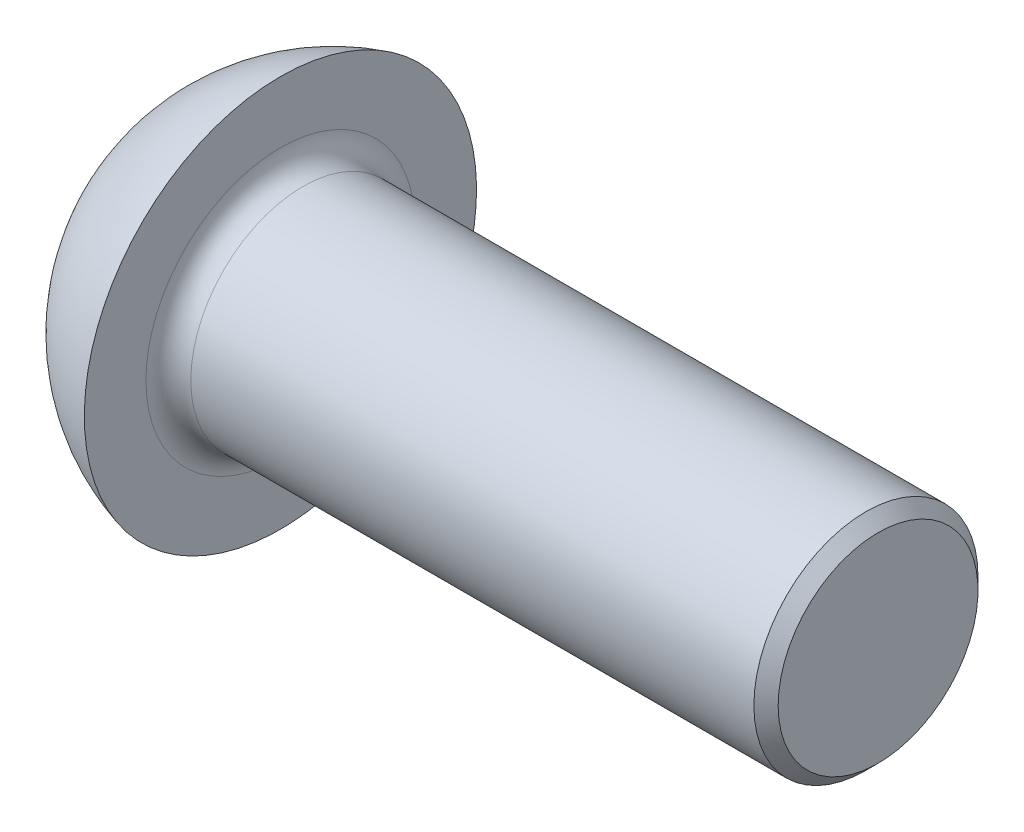
ISO-10303-21;
HEADER;
FILE_DESCRIPTION(('STEP AP214'),'2;1');
FILE_NAME('part.step','',(''),(''),'','','');
FILE_SCHEMA(('AUTOMOTIVE_DESIGN { 1 0 10303 214 1 1 1 1 }'));
ENDSEC;
DATA;
#1=APPLICATION_CONTEXT('core data for automotive mechanical design processes');
#2=APPLICATION_PROTOCOL_DEFINITION('international standard','automotive_design',2000,#1);
#3=PRODUCT_CONTEXT('',#1,'mechanical');
#4=PRODUCT('Part','Part','',(#3));
#5=PRODUCT_RELATED_PRODUCT_CATEGORY('part','',(#4));
#6=PRODUCT_DEFINITION_FORMATION('','',#4);
#7=PRODUCT_DEFINITION_CONTEXT('part definition',#1,'design');
#8=PRODUCT_DEFINITION('design','',#6,#7);
#9=PRODUCT_DEFINITION_SHAPE('','',#8);
#10=(LENGTH_UNIT() NAMED_UNIT(*) SI_UNIT(.MILLI.,.METRE.));
#11=(NAMED_UNIT(*) PLANE_ANGLE_UNIT() SI_UNIT($,.RADIAN.));
#12=(NAMED_UNIT(*) SI_UNIT($,.STERADIAN.) SOLID_ANGLE_UNIT());
#13=UNCERTAINTY_MEASURE_WITH_UNIT(LENGTH_MEASURE(1.E-05),#10,'distance_accuracy_value','');
#14=(GEOMETRIC_REPRESENTATION_CONTEXT(3) GLOBAL_UNCERTAINTY_ASSIGNED_CONTEXT((#13)) GLOBAL_UNIT_ASSIGNED_CONTEXT((#10,
#11,#12)) REPRESENTATION_CONTEXT('',''));
#15=CARTESIAN_POINT('',(0.,0.,0.));
#16=DIRECTION('',(0.,0.,1.));
#17=DIRECTION('',(1.,0.,0.));
#18=AXIS2_PLACEMENT_3D('',#15,#16,#17);
#19=CARTESIAN_POINT('',(-3.3,0.,0.));
#20=DIRECTION('',(-1.,0.,0.));
#21=DIRECTION('',(0.,0.,1.));
#22=AXIS2_PLACEMENT_3D('',#19,#20,#21);
#23=PLANE('',#22);
#24=CARTESIAN_POINT('',(-3.3,0.,0.));
#25=DIRECTION('',(-1.,0.,0.));
#26=DIRECTION('',(0.,0.,1.));
#27=AXIS2_PLACEMENT_3D('',#24,#25,#26);
#28=CIRCLE('',#27,2.71809868883777);
#29=CARTESIAN_POINT('',(-3.3,2.71809868883778,0.));
#30=VERTEX_POINT('',#29);
#31=EDGE_CURVE('E230',#30,#30,#28,.T.);
#32=ORIENTED_EDGE('',*,*,#31,.T.);
#33=EDGE_LOOP('',(#32));
#34=FACE_BOUND('',#33,.T.);
#35=DIRECTION('',(0.,0.,1.));
#36=VECTOR('',#35,1.);
#37=CARTESIAN_POINT('',(-3.3,2.00051868274205,0.));
#38=LINE('',#37,#36);
#39=CARTESIAN_POINT('',(-3.3,2.00051868274205,-1.155));
#40=VERTEX_POINT('',#39);
#41=CARTESIAN_POINT('',(-3.3,2.00051868274205,1.155));
#42=VERTEX_POINT('',#41);
#43=EDGE_CURVE('E111',#40,#42,#38,.T.);
#44=ORIENTED_EDGE('',*,*,#43,.T.);
#45=DIRECTION('',(0.,-0.866025403784439,0.5));
#46=VECTOR('',#45,1.);
#47=CARTESIAN_POINT('',(-3.3,1.00025934137103,1.7325));
#48=LINE('',#47,#46);
#49=CARTESIAN_POINT('',(-3.3,0.,2.31));
#50=VERTEX_POINT('',#49);
#51=EDGE_CURVE('E10',#42,#50,#48,.T.);
#52=ORIENTED_EDGE('',*,*,#51,.T.);
#53=DIRECTION('',(0.,-0.866025403784439,-0.5));
#54=VECTOR('',#53,1.);
#55=CARTESIAN_POINT('',(-3.3,-1.00025934137103,1.7325));
#56=LINE('',#55,#54);
#57=CARTESIAN_POINT('',(-3.3,-2.00051868274205,1.155));
#58=VERTEX_POINT('',#57);
#59=EDGE_CURVE('E24',#50,#58,#56,.T.);
#60=ORIENTED_EDGE('',*,*,#59,.T.);
#61=DIRECTION('',(0.,0.,-1.));
#62=VECTOR('',#61,1.);
#63=CARTESIAN_POINT('',(-3.3,-2.00051868274205,0.));
#64=LINE('',#63,#62);
#65=CARTESIAN_POINT('',(-3.3,-2.00051868274205,-1.155));
#66=VERTEX_POINT('',#65);
#67=EDGE_CURVE('E240',#58,#66,#64,.T.);
#68=ORIENTED_EDGE('',*,*,#67,.T.);
#69=DIRECTION('',(0.,0.866025403784439,-0.5));
#70=VECTOR('',#69,1.);
#71=CARTESIAN_POINT('',(-3.3,-1.00025934137103,-1.7325));
#72=LINE('',#71,#70);
#73=CARTESIAN_POINT('',(-3.3,0.,-2.31));
#74=VERTEX_POINT('',#73);
#75=EDGE_CURVE('E236',#66,#74,#72,.T.);
#76=ORIENTED_EDGE('',*,*,#75,.T.);
#77=DIRECTION('',(0.,0.866025403784439,0.5));
#78=VECTOR('',#77,1.);
#79=CARTESIAN_POINT('',(-3.3,1.00025934137103,-1.7325));
#80=LINE('',#79,#78);
#81=EDGE_CURVE('E227',#74,#40,#80,.T.);
#82=ORIENTED_EDGE('',*,*,#81,.T.);
#83=EDGE_LOOP('',(#44,#52,#60,#68,#76,#82));
#84=FACE_BOUND('',#83,.T.);
#85=ADVANCED_FACE('F15',(#34,#84),#23,.T.);
#86=CARTESIAN_POINT('',(0.6,0.,0.));
#87=DIRECTION('',(-1.,0.,0.));
#88=DIRECTION('',(0.,0.,1.));
#89=AXIS2_PLACEMENT_3D('',#86,#87,#88);
#90=TOROIDAL_SURFACE('',#89,3.6,0.6);
#91=CARTESIAN_POINT('',(0.6,0.,0.));
#92=DIRECTION('',(-1.,0.,0.));
#93=DIRECTION('',(0.,0.,1.));
#94=AXIS2_PLACEMENT_3D('',#91,#92,#93);
#95=CIRCLE('',#94,3.);
#96=CARTESIAN_POINT('',(0.6,0.,3.));
#97=VERTEX_POINT('',#96);
#98=EDGE_CURVE('E276',#97,#97,#95,.T.);
#99=ORIENTED_EDGE('',*,*,#98,.T.);
#100=EDGE_LOOP('',(#99));
#101=FACE_BOUND('',#100,.T.);
#102=CARTESIAN_POINT('',(0.,0.,0.));
#103=DIRECTION('',(-1.,0.,0.));
#104=DIRECTION('',(0.,0.,1.));
#105=AXIS2_PLACEMENT_3D('',#102,#103,#104);
#106=CIRCLE('',#105,3.6);
#107=CARTESIAN_POINT('',(0.,0.,3.6));
#108=VERTEX_POINT('',#107);
#109=EDGE_CURVE('E220',#108,#108,#106,.T.);
#110=ORIENTED_EDGE('',*,*,#109,.F.);
#111=EDGE_LOOP('',(#110));
#112=FACE_BOUND('',#111,.T.);
#113=ADVANCED_FACE('F17',(#101,#112),#90,.F.);
#114=CARTESIAN_POINT('',(0.,3.6,0.));
#115=DIRECTION('',(-1.,0.,0.));
#116=DIRECTION('',(0.,0.,1.));
#117=AXIS2_PLACEMENT_3D('',#114,#115,#116);
#118=PLANE('',#117);
#119=CARTESIAN_POINT('',(0.,0.,0.));
#120=DIRECTION('',(-1.,0.,0.));
#121=DIRECTION('',(0.,0.,1.));
#122=AXIS2_PLACEMENT_3D('',#119,#120,#121);
#123=CIRCLE('',#122,5.25);
#124=CARTESIAN_POINT('',(0.,5.25,0.));
#125=VERTEX_POINT('',#124);
#126=EDGE_CURVE('E217',#125,#125,#123,.T.);
#127=ORIENTED_EDGE('',*,*,#126,.F.);
#128=EDGE_LOOP('',(#127));
#129=FACE_BOUND('',#128,.T.);
#130=ORIENTED_EDGE('',*,*,#109,.T.);
#131=EDGE_LOOP('',(#130));
#132=FACE_BOUND('',#131,.T.);
#133=ADVANCED_FACE('F200',(#129,#132),#118,.F.);
#134=CARTESIAN_POINT('',(1.40673326026339,0.,0.));
#135=DIRECTION('',(-1.,0.,0.));
#136=DIRECTION('',(0.,1.,0.));
#137=AXIS2_PLACEMENT_3D('',#134,#135,#136);
#138=SPHERICAL_SURFACE('',#137,5.43519994715294);
#139=CARTESIAN_POINT('',(-3.3,2.71809868883778,0.));
#140=CARTESIAN_POINT('',(-3.27776570778857,2.75660042690061,0.));
#141=CARTESIAN_POINT('',(-3.25505879454552,2.79482922452048,0.));
#142=CARTESIAN_POINT('',(-3.20871384233075,2.87071818755479,0.));
#143=CARTESIAN_POINT('',(-3.18507580335902,2.90837835296923,0.));
#144=CARTESIAN_POINT('',(-3.13688271602146,2.98310730027314,0.));
#145=CARTESIAN_POINT('',(-3.11232766765562,3.02017608216262,0.));
#146=CARTESIAN_POINT('',(-3.06231538033311,3.09369995898224,0.));
#147=CARTESIAN_POINT('',(-3.03685814137642,3.13015505391239,0.));
#148=CARTESIAN_POINT('',(-2.98505679471658,3.20242959835595,0.));
#149=CARTESIAN_POINT('',(-2.95871268701341,3.23824904786935,0.));
#150=CARTESIAN_POINT('',(-2.90515346956454,3.30923073239539,0.));
#151=CARTESIAN_POINT('',(-2.87793835981883,3.34439296740802,0.));
#152=CARTESIAN_POINT('',(-2.82265352661596,3.41403904785795,0.));
#153=CARTESIAN_POINT('',(-2.79458380315879,3.44852289329525,0.));
#154=CARTESIAN_POINT('',(-2.73760664628698,3.51679142851922,0.));
#155=CARTESIAN_POINT('',(-2.70869921287235,3.55057611830588,0.));
#156=CARTESIAN_POINT('',(-2.65006404410115,3.61742599705813,0.));
#157=CARTESIAN_POINT('',(-2.62033630874457,3.65049118602372,0.));
#158=CARTESIAN_POINT('',(-2.56007843814651,3.71588215128081,0.));
#159=CARTESIAN_POINT('',(-2.52954830290502,3.74820792757231,0.));
#160=CARTESIAN_POINT('',(-2.46770401778455,3.81210060089351,0.));
#161=CARTESIAN_POINT('',(-2.43638986790557,3.84366749792321,0.));
#162=CARTESIAN_POINT('',(-2.37299641089524,3.90602340313269,0.));
#163=CARTESIAN_POINT('',(-2.34091710376389,3.93681241131247,0.));
#164=CARTESIAN_POINT('',(-2.27601265041062,3.99759399767809,0.));
#165=CARTESIAN_POINT('',(-2.24318750418871,4.02758657586392,0.));
#166=CARTESIAN_POINT('',(-2.17681113996081,4.08675724070804,0.));
#167=CARTESIAN_POINT('',(-2.14325992195482,4.11593532736632,0.));
#168=CARTESIAN_POINT('',(-2.07545161870568,4.17345943810852,0.));
#169=CARTESIAN_POINT('',(-2.04119453346252,4.20180546219244,0.));
#170=CARTESIAN_POINT('',(-1.97199512535929,4.25764837780733,0.));
#171=CARTESIAN_POINT('',(-1.93705280249922,4.2851452693383,0.));
#172=CARTESIAN_POINT('',(-1.86650396143256,4.33927336121637,0.));
#173=CARTESIAN_POINT('',(-1.83089744322598,4.36590456156347,0.));
#174=CARTESIAN_POINT('',(-1.75904165371523,4.41828523376225,0.));
#175=CARTESIAN_POINT('',(-1.72279238241106,4.44403470561391,0.));
#176=CARTESIAN_POINT('',(-1.64967291602002,4.49463641448721,0.));
#177=CARTESIAN_POINT('',(-1.61280272093315,4.51948865150885,0.));
#178=CARTESIAN_POINT('',(-1.53846361021198,4.56828092470242,0.));
#179=CARTESIAN_POINT('',(-1.50099469457769,4.59222096087435,0.));
#180=CARTESIAN_POINT('',(-1.42548070654649,4.63917441567621,0.));
#181=CARTESIAN_POINT('',(-1.38743563414958,4.66218783430614,0.));
#182=CARTESIAN_POINT('',(-1.31079224333973,4.70727419534119,0.));
#183=CARTESIAN_POINT('',(-1.27219392492679,4.72934713774631,0.));
#184=CARTESIAN_POINT('',(-1.19446728599589,4.77253925400262,0.));
#185=CARTESIAN_POINT('',(-1.15533896547794,4.7936584278538,0.));
#186=CARTESIAN_POINT('',(-1.0765758854167,4.8349302890371,0.));
#187=CARTESIAN_POINT('',(-1.03694112587342,4.85508297636923,0.));
#188=CARTESIAN_POINT('',(-0.957189035813875,4.89440972855083,0.));
#189=CARTESIAN_POINT('',(-0.917071705297622,4.91358379340031,0.));
#190=CARTESIAN_POINT('',(-0.836378631967217,4.9509417540421,0.));
#191=CARTESIAN_POINT('',(-0.795802889153065,4.96912564983441,0.));
#192=CARTESIAN_POINT('',(-0.714217425889179,5.00449232183398,0.));
#193=CARTESIAN_POINT('',(-0.673207705439446,5.02167509804124,0.));
#194=CARTESIAN_POINT('',(-0.590778983164408,5.05502918408769,0.));
#195=CARTESIAN_POINT('',(-0.549359981339102,5.07120049392688,0.));
#196=CARTESIAN_POINT('',(-0.466137638085642,5.10252190631043,0.));
#197=CARTESIAN_POINT('',(-0.424334296657488,5.1176720088548,0.));
#198=CARTESIAN_POINT('',(-0.340368450990369,5.14694189281806,0.));
#199=CARTESIAN_POINT('',(-0.298205946751405,5.16106167423696,0.));
#200=CARTESIAN_POINT('',(-0.213547155219295,5.18826237732713,0.));
#201=CARTESIAN_POINT('',(-0.171050867926149,5.20134329899841,0.));
#202=CARTESIAN_POINT('',(-0.0857501407696926,5.22645853845163,0.));
#203=CARTESIAN_POINT('',(-0.0429457009063826,5.23849285623358,0.));
#204=CARTESIAN_POINT('',(0.,5.25,0.));
#205=B_SPLINE_CURVE_WITH_KNOTS('',3,(#139,#140,#141,#142,#143,#144,#145,#146,#147,#148,#149,
#150,#151,#152,#153,#154,#155,#156,#157,#158,#159,#160,#161,#162,#163,#164,#165,#166,#167,#168,
#169,#170,#171,#172,#173,#174,#175,#176,#177,#178,#179,#180,#181,#182,#183,#184,#185,#186,#187,
#188,#189,#190,#191,#192,#193,#194,#195,#196,#197,#198,#199,#200,#201,#202,#203,#204),
.UNSPECIFIED.,.F.,.F.,(4,2,2,2,2,2,2,2,2,2,2,2,2,2,2,2,2,2,2,2,2,2,2,2,2,2,2,2,2,2,2,2,4),(0.,
0.133378533451595,0.266757066903191,0.400135600354786,0.533514133806381,0.666892667257976,
0.800271200709571,0.933649734161166,1.06702826761276,1.20040680106436,1.33378533451595,
1.46716386796755,1.60054240141914,1.73392093487074,1.86729946832233,2.00067800177393,
2.13405653522553,2.26743506867712,2.40081360212872,2.53419213558031,2.66757066903191,
2.8009492024835,2.9343277359351,3.06770626938669,3.20108480283829,3.33446333628988,
3.46784186974148,3.60122040319307,3.73459893664467,3.86797747009626,4.00135600354786,
4.13473453699946,4.26811307045105),.UNSPECIFIED.);
#206=EDGE_CURVE('BSEAM207',#30,#125,#205,.T.);
#207=ORIENTED_EDGE('',*,*,#31,.F.);
#208=ORIENTED_EDGE('',*,*,#126,.T.);
#209=ORIENTED_EDGE('',*,*,#206,.T.);
#210=ORIENTED_EDGE('',*,*,#206,.F.);
#211=EDGE_LOOP('',(#207,#209,#208,#210));
#212=FACE_BOUND('',#211,.T.);
#213=ADVANCED_FACE('F207',(#212),#138,.T.);
#214=CARTESIAN_POINT('',(16.,0.,0.));
#215=DIRECTION('',(-1.,0.,0.));
#216=DIRECTION('',(0.,0.,1.));
#217=AXIS2_PLACEMENT_3D('',#214,#215,#216);
#218=PLANE('',#217);
#219=CARTESIAN_POINT('',(16.,0.,0.));
#220=DIRECTION('',(-1.,0.,0.));
#221=DIRECTION('',(0.,0.,1.));
#222=AXIS2_PLACEMENT_3D('',#219,#220,#221);
#223=CIRCLE('',#222,2.67525);
#224=CARTESIAN_POINT('',(16.,0.,2.67525));
#225=VERTEX_POINT('',#224);
#226=EDGE_CURVE('E275',#225,#225,#223,.T.);
#227=ORIENTED_EDGE('',*,*,#226,.F.);
#228=EDGE_LOOP('',(#227));
#229=FACE_BOUND('',#228,.T.);
#230=ADVANCED_FACE('F206',(#229),#218,.F.);
#231=CARTESIAN_POINT('',(16.,0.,0.));
#232=DIRECTION('',(-1.,0.,0.));
#233=DIRECTION('',(0.,0.,1.));
#234=AXIS2_PLACEMENT_3D('',#231,#232,#233);
#235=CONICAL_SURFACE('',#234,2.67525,0.785398163397448);
#236=CARTESIAN_POINT('',(15.67525,0.,0.));
#237=DIRECTION('',(-1.,0.,0.));
#238=DIRECTION('',(0.,0.,1.));
#239=AXIS2_PLACEMENT_3D('',#236,#237,#238);
#240=CIRCLE('',#239,3.);
#241=CARTESIAN_POINT('',(15.67525,0.,3.));
#242=VERTEX_POINT('',#241);
#243=EDGE_CURVE('E271',#242,#242,#240,.T.);
#244=ORIENTED_EDGE('',*,*,#243,.F.);
#245=EDGE_LOOP('',(#244));
#246=FACE_BOUND('',#245,.T.);
#247=ORIENTED_EDGE('',*,*,#226,.T.);
#248=EDGE_LOOP('',(#247));
#249=FACE_BOUND('',#248,.T.);
#250=ADVANCED_FACE('F291',(#246,#249),#235,.T.);
#251=CARTESIAN_POINT('',(0.,0.,0.));
#252=DIRECTION('',(-1.,0.,0.));
#253=DIRECTION('',(0.,0.,1.));
#254=AXIS2_PLACEMENT_3D('',#251,#252,#253);
#255=CYLINDRICAL_SURFACE('',#254,3.);
#256=ORIENTED_EDGE('',*,*,#243,.T.);
#257=EDGE_LOOP('',(#256));
#258=FACE_BOUND('',#257,.T.);
#259=ORIENTED_EDGE('',*,*,#98,.F.);
#260=EDGE_LOOP('',(#259));
#261=FACE_BOUND('',#260,.T.);
#262=ADVANCED_FACE('F149',(#258,#261),#255,.T.);
#263=CARTESIAN_POINT('',(0.112679121828036,2.00051868274205,1.155));
#264=DIRECTION('',(0.,-0.5,-0.866025403784438));
#265=DIRECTION('',(0.,0.866025403784439,-0.5));
#266=AXIS2_PLACEMENT_3D('',#263,#264,#265);
#267=PLANE('',#266);
#268=DIRECTION('',(-1.,0.,0.));
#269=VECTOR('',#268,1.);
#270=CARTESIAN_POINT('',(0.112679121828036,2.00051868274205,1.155));
#271=LINE('',#270,#269);
#272=CARTESIAN_POINT('',(-1.221,2.00051868274205,1.155));
#273=VERTEX_POINT('',#272);
#274=EDGE_CURVE('E35',#273,#42,#271,.T.);
#275=ORIENTED_EDGE('',*,*,#274,.F.);
#276=CARTESIAN_POINT('',(-1.22100066666717,-1.99999999990584E-06,2.31000115470054));
#277=CARTESIAN_POINT('',(-1.19168855717919,0.0879087142789007,2.25924588014696));
#278=CARTESIAN_POINT('',(-1.16503071931838,0.176578272518489,2.20805248682841));
#279=CARTESIAN_POINT('',(-1.11850024478769,0.355452645837356,2.10477931924164));
#280=CARTESIAN_POINT('',(-1.09864406707242,0.445660638153868,2.05269771059465));
#281=CARTESIAN_POINT('',(-1.06773646866209,0.62495871934513,1.94917991515369));
#282=CARTESIAN_POINT('',(-1.05647931723026,0.714021228502352,1.89775965151706));
#283=CARTESIAN_POINT('',(-1.04304309543633,0.892565100679253,1.79467729885357));
#284=CARTESIAN_POINT('',(-1.04085289609961,0.982045815177746,1.74301558425058));
#285=CARTESIAN_POINT('',(-1.04542068601433,1.14923119457287,1.64649106045224));
#286=CARTESIAN_POINT('',(-1.05105713137857,1.2269609459042,1.60161376759706));
#287=CARTESIAN_POINT('',(-1.06891780774927,1.38191406414319,1.51215154307));
#288=CARTESIAN_POINT('',(-1.08114813406541,1.459136895502,1.46756692059741));
#289=CARTESIAN_POINT('',(-1.11172160833131,1.61440923657973,1.37792039267848));
#290=CARTESIAN_POINT('',(-1.13019429588456,1.69243910421603,1.33286982759383));
#291=CARTESIAN_POINT('',(-1.17211949687853,1.84733535485597,1.2434404355904));
#292=CARTESIAN_POINT('',(-1.19556216577033,1.92420372075742,1.19906046384503));
#293=CARTESIAN_POINT('',(-1.22100066666717,2.00052068274205,1.15499884529946));
#294=B_SPLINE_CURVE_WITH_KNOTS('',3,(#276,#277,#278,#279,#280,#281,#282,#283,#284,#285,#286,
#287,#288,#289,#290,#291,#292,#293),.UNSPECIFIED.,.F.,.F.,(4,2,2,2,2,2,2,2,4),(0.,
0.317098385044298,0.634958765896791,0.944953071500566,1.25456677031687,1.52410456996802,
1.79389195560933,2.06966196417866,2.3448907470989),.UNSPECIFIED.);
#295=CARTESIAN_POINT('',(-1.221,0.,2.31));
#296=VERTEX_POINT('',#295);
#297=EDGE_CURVE('E105',#296,#273,#294,.T.);
#298=ORIENTED_EDGE('',*,*,#297,.F.);
#299=DIRECTION('',(-1.,0.,0.));
#300=VECTOR('',#299,1.);
#301=CARTESIAN_POINT('',(0.112679121828036,0.,2.31));
#302=LINE('',#301,#300);
#303=EDGE_CURVE('E107',#296,#50,#302,.T.);
#304=ORIENTED_EDGE('',*,*,#303,.T.);
#305=ORIENTED_EDGE('',*,*,#51,.F.);
#306=EDGE_LOOP('',(#275,#298,#304,#305));
#307=FACE_BOUND('',#306,.T.);
#308=ADVANCED_FACE('F146',(#307),#267,.T.);
#309=CARTESIAN_POINT('',(0.112679121828036,0.,2.31));
#310=DIRECTION('',(0.,0.5,-0.866025403784439));
#311=DIRECTION('',(0.,0.866025403784439,0.5));
#312=AXIS2_PLACEMENT_3D('',#309,#310,#311);
#313=PLANE('',#312);
#314=ORIENTED_EDGE('',*,*,#303,.F.);
#315=CARTESIAN_POINT('',(-1.22100066666717,-2.00052068274205,1.15499884529946));
#316=CARTESIAN_POINT('',(-1.19168855717919,-1.91260996846315,1.20575411985304));
#317=CARTESIAN_POINT('',(-1.16503071931838,-1.82394041022357,1.25694751317159));
#318=CARTESIAN_POINT('',(-1.11850024478769,-1.6450660369047,1.36022068075836));
#319=CARTESIAN_POINT('',(-1.09864406707242,-1.55485804458819,1.41230228940536));
#320=CARTESIAN_POINT('',(-1.06773646866209,-1.37555996339692,1.51582008484631));
#321=CARTESIAN_POINT('',(-1.05647931723026,-1.2864974542397,1.56724034848294));
#322=CARTESIAN_POINT('',(-1.04304309543633,-1.1079535820628,1.67032270114643));
#323=CARTESIAN_POINT('',(-1.04085289609961,-1.01847286756431,1.72198441574942));
#324=CARTESIAN_POINT('',(-1.04542068601433,-0.851287488169181,1.81850893954776));
#325=CARTESIAN_POINT('',(-1.05105713137857,-0.773557736837857,1.86338623240295));
#326=CARTESIAN_POINT('',(-1.06891780774927,-0.618604618598859,1.95284845693));
#327=CARTESIAN_POINT('',(-1.08114813406541,-0.541381787240053,1.99743307940259));
#328=CARTESIAN_POINT('',(-1.11172160833131,-0.386109446162325,2.08707960732152));
#329=CARTESIAN_POINT('',(-1.13019429588456,-0.308079578526021,2.13213017240618));
#330=CARTESIAN_POINT('',(-1.17211949687853,-0.153183327886088,2.2215595644096));
#331=CARTESIAN_POINT('',(-1.19556216577032,-0.076314961984636,2.26593953615498));
#332=CARTESIAN_POINT('',(-1.22100066666717,1.99999999983813E-06,2.31000115470054));
#333=B_SPLINE_CURVE_WITH_KNOTS('',3,(#315,#316,#317,#318,#319,#320,#321,#322,#323,#324,#325,
#326,#327,#328,#329,#330,#331,#332),.UNSPECIFIED.,.F.,.F.,(4,2,2,2,2,2,2,2,4),(0.,
0.317098385044298,0.634958765896792,0.944953071500566,1.25456677031687,1.52410456996802,
1.79389195560933,2.06966196417866,2.3448907470989),.UNSPECIFIED.);
#334=CARTESIAN_POINT('',(-1.221,-2.00051868274205,1.155));
#335=VERTEX_POINT('',#334);
#336=EDGE_CURVE('E168',#335,#296,#333,.T.);
#337=ORIENTED_EDGE('',*,*,#336,.F.);
#338=DIRECTION('',(-1.,0.,0.));
#339=VECTOR('',#338,1.);
#340=CARTESIAN_POINT('',(0.112679121828036,-2.00051868274205,1.155));
#341=LINE('',#340,#339);
#342=EDGE_CURVE('E127',#335,#58,#341,.T.);
#343=ORIENTED_EDGE('',*,*,#342,.T.);
#344=ORIENTED_EDGE('',*,*,#59,.F.);
#345=EDGE_LOOP('',(#314,#337,#343,#344));
#346=FACE_BOUND('',#345,.T.);
#347=ADVANCED_FACE('F177',(#346),#313,.T.);
#348=CARTESIAN_POINT('',(0.112679121828036,-2.00051868274205,1.155));
#349=DIRECTION('',(0.,1.,0.));
#350=DIRECTION('',(0.,0.,1.));
#351=AXIS2_PLACEMENT_3D('',#348,#349,#350);
#352=PLANE('',#351);
#353=ORIENTED_EDGE('',*,*,#342,.F.);
#354=CARTESIAN_POINT('',(-1.96486344254237,-2.00051868274205,-2.99106574991461));
#355=CARTESIAN_POINT('',(-1.92341713222192,-2.00051868274206,-2.90467646408609));
#356=CARTESIAN_POINT('',(-1.88240131637519,-2.00051868274206,-2.81807672218171));
#357=CARTESIAN_POINT('',(-1.80147488598728,-2.00051868274206,-2.64434415859902));
#358=CARTESIAN_POINT('',(-1.76156447034466,-2.00051868274206,-2.55721124438478));
#359=CARTESIAN_POINT('',(-1.68287009240706,-2.00051868274206,-2.38180057381137));
#360=CARTESIAN_POINT('',(-1.64409443179321,-2.00051868274206,-2.29351907901038));
#361=CARTESIAN_POINT('',(-1.56828190794744,-2.00051868274206,-2.11621528914752));
#362=CARTESIAN_POINT('',(-1.53124495430565,-2.00051868274206,-2.02719303288802));
#363=CARTESIAN_POINT('',(-1.45842973078601,-2.00051868274206,-1.8459211063055));
#364=CARTESIAN_POINT('',(-1.42270968838263,-2.00051868274206,-1.75364790835579));
#365=CARTESIAN_POINT('',(-1.35423939411274,-2.00051868274206,-1.5679854011052));
#366=CARTESIAN_POINT('',(-1.3214894866978,-2.00051868274206,-1.47459596376994));
#367=CARTESIAN_POINT('',(-1.25989601864799,-2.00051868274206,-1.28676809316697));
#368=CARTESIAN_POINT('',(-1.23104342405924,-2.00051868274206,-1.1923326546309));
#369=CARTESIAN_POINT('',(-1.17823123610334,-2.00051868274206,-1.00210841697646));
#370=CARTESIAN_POINT('',(-1.15427042752419,-2.00051868274205,-0.906319960310622));
#371=CARTESIAN_POINT('',(-1.11251932763981,-2.00051868274205,-0.713588996276917));
#372=CARTESIAN_POINT('',(-1.09471636286061,-2.00051868274206,-0.616649289048342));
#373=CARTESIAN_POINT('',(-1.0664458836495,-2.00051868274206,-0.421685991825815));
#374=CARTESIAN_POINT('',(-1.05597787350874,-2.00051868274206,-0.323662475532428));
#375=CARTESIAN_POINT('',(-1.04335162324216,-2.00051868274206,-0.128245662582835));
#376=CARTESIAN_POINT('',(-1.04109532184743,-2.00051868274206,-0.0308588869559939));
#377=CARTESIAN_POINT('',(-1.04482032135012,-2.00051868274206,0.163753364892289));
#378=CARTESIAN_POINT('',(-1.05080213231832,-2.00051868274205,0.260978830752897));
#379=CARTESIAN_POINT('',(-1.0751989965382,-2.00051868274205,0.500868361489807));
#380=CARTESIAN_POINT('',(-1.09818614402891,-2.00051868274205,0.64306761031878));
#381=CARTESIAN_POINT('',(-1.15746330108004,-2.00051868274205,0.924700815263805));
#382=CARTESIAN_POINT('',(-1.19376934378083,-2.00051868274205,1.06413122414457));
#383=CARTESIAN_POINT('',(-1.25578894948546,-2.00051868274205,1.27266474475506));
#384=CARTESIAN_POINT('',(-1.27801149821052,-2.00051868274205,1.3428457838011));
#385=CARTESIAN_POINT('',(-1.32451230745966,-2.00051868274205,1.48247732144982));
#386=CARTESIAN_POINT('',(-1.3487892850608,-2.00051868274205,1.55192824596034));
#387=CARTESIAN_POINT('',(-1.39904638030175,-2.00051868274205,1.69019236764795));
#388=CARTESIAN_POINT('',(-1.42502618842139,-2.00051868274205,1.75900567814174));
#389=CARTESIAN_POINT('',(-1.47840793106231,-2.00051868274205,1.89609007360979));
#390=CARTESIAN_POINT('',(-1.50581010585768,-2.00051868274205,1.96436106471178));
#391=CARTESIAN_POINT('',(-1.57751032855285,-2.00051868274205,2.13862488988357));
#392=CARTESIAN_POINT('',(-1.62265434191477,-2.00051868274205,2.24426928205529));
#393=CARTESIAN_POINT('',(-1.71511856231348,-2.00051868274205,2.45460406457459));
#394=CARTESIAN_POINT('',(-1.76243893237508,-2.00051868274205,2.55929438274908));
#395=CARTESIAN_POINT('',(-1.90689738918691,-2.00051868274205,2.87225211988385));
#396=CARTESIAN_POINT('',(-2.00651801302575,-2.00051868274205,3.07937136470463));
#397=CARTESIAN_POINT('',(-2.2099373336573,-2.00051868274205,3.49184036623577));
#398=CARTESIAN_POINT('',(-2.31374101612314,-2.00051868274205,3.69718763465502));
#399=CARTESIAN_POINT('',(-2.52401751355147,-2.00051868274205,4.10647524785957));
#400=CARTESIAN_POINT('',(-2.63048998924749,-2.00051868274205,4.31041576731465));
#401=CARTESIAN_POINT('',(-2.83513728282128,-2.00051868274205,4.69811993154027));
#402=CARTESIAN_POINT('',(-2.93314675843344,-2.00051868274205,4.88197115509709));
#403=CARTESIAN_POINT('',(-3.13028243223674,-2.00051868274205,5.24908220486923));
#404=CARTESIAN_POINT('',(-3.22940867175413,-2.00051868274205,5.43234200887388));
#405=CARTESIAN_POINT('',(-3.42824462740585,-2.00051868274205,5.79794043029788));
#406=CARTESIAN_POINT('',(-3.52795221817154,-2.00051868274205,5.98028020517565));
#407=CARTESIAN_POINT('',(-3.72801635517332,-2.00051868274205,6.34459110603012));
#408=CARTESIAN_POINT('',(-3.82837286717533,-2.00051868274205,6.52656225079953));
#409=CARTESIAN_POINT('',(-3.92896734021962,-2.00051868274205,6.7084009549629));
#410=B_SPLINE_CURVE_WITH_KNOTS('',3,(#354,#355,#356,#357,#358,#359,#360,#361,#362,#363,#364,
#365,#366,#367,#368,#369,#370,#371,#372,#373,#374,#375,#376,#377,#378,#379,#380,#381,#382,#383,
#384,#385,#386,#387,#388,#389,#390,#391,#392,#393,#394,#395,#396,#397,#398,#399,#400,#401,#402,
#403,#404,#405,#406,#407,#408,#409),.UNSPECIFIED.,.F.,.F.,(4,2,2,2,2,2,2,2,2,2,2,2,2,2,2,2,2,2,
2,2,2,2,2,2,2,2,2,4),(0.,0.287455208985095,0.5749618091396,0.864212434551272,1.15344800271339,
1.45024583117931,1.74707803589209,2.04320992393841,2.33926815747718,2.63471339575131,
2.9301386654021,3.22202427853605,3.51392796486597,3.94517706763767,4.37694701604226,
4.59776874699088,4.81845358550315,5.03909842121499,5.25978065155584,5.60440215562008,
5.94904951649869,6.6384580701406,7.32871413345087,8.01888288957716,8.64390985455155,
9.26896002534036,9.89242037565896,10.5158480991764),.UNSPECIFIED.);
#411=CARTESIAN_POINT('',(-1.221,-2.00051868274205,-1.155));
#412=VERTEX_POINT('',#411);
#413=EDGE_CURVE('E162',#412,#335,#410,.T.);
#414=ORIENTED_EDGE('',*,*,#413,.F.);
#415=DIRECTION('',(-1.,0.,0.));
#416=VECTOR('',#415,1.);
#417=CARTESIAN_POINT('',(0.112679121828036,-2.00051868274205,-1.155));
#418=LINE('',#417,#416);
#419=EDGE_CURVE('E119',#412,#66,#418,.T.);
#420=ORIENTED_EDGE('',*,*,#419,.T.);
#421=ORIENTED_EDGE('',*,*,#67,.F.);
#422=EDGE_LOOP('',(#353,#414,#420,#421));
#423=FACE_BOUND('',#422,.T.);
#424=ADVANCED_FACE('F180',(#423),#352,.T.);
#425=CARTESIAN_POINT('',(0.112679121828036,-2.00051868274205,-1.155));
#426=DIRECTION('',(0.,0.5,0.866025403784439));
#427=DIRECTION('',(0.,-0.866025403784439,0.5));
#428=AXIS2_PLACEMENT_3D('',#425,#426,#427);
#429=PLANE('',#428);
#430=ORIENTED_EDGE('',*,*,#419,.F.);
#431=CARTESIAN_POINT('',(-1.22100066666717,1.99999999972245E-06,-2.31000115470054));
#432=CARTESIAN_POINT('',(-1.19168855717919,-0.0879087142789005,-2.25924588014696));
#433=CARTESIAN_POINT('',(-1.16503071931838,-0.176578272518488,-2.20805248682841));
#434=CARTESIAN_POINT('',(-1.11850024478769,-0.355452645837356,-2.10477931924164));
#435=CARTESIAN_POINT('',(-1.09864406707242,-0.445660638153868,-2.05269771059464));
#436=CARTESIAN_POINT('',(-1.06773646866209,-0.624958719345129,-1.94917991515369));
#437=CARTESIAN_POINT('',(-1.05647931723026,-0.714021228502351,-1.89775965151706));
#438=CARTESIAN_POINT('',(-1.04304309543633,-0.892565100679252,-1.79467729885357));
#439=CARTESIAN_POINT('',(-1.04085289609961,-0.982045815177746,-1.74301558425058));
#440=CARTESIAN_POINT('',(-1.04542068601433,-1.14923119457287,-1.64649106045224));
#441=CARTESIAN_POINT('',(-1.05105713137857,-1.2269609459042,-1.60161376759706));
#442=CARTESIAN_POINT('',(-1.06891780774927,-1.38191406414319,-1.51215154307));
#443=CARTESIAN_POINT('',(-1.08114813406541,-1.459136895502,-1.46756692059741));
#444=CARTESIAN_POINT('',(-1.11172160833131,-1.61440923657973,-1.37792039267848));
#445=CARTESIAN_POINT('',(-1.13019429588456,-1.69243910421603,-1.33286982759383));
#446=CARTESIAN_POINT('',(-1.17211949687853,-1.84733535485597,-1.2434404355904));
#447=CARTESIAN_POINT('',(-1.19556216577033,-1.92420372075742,-1.19906046384503));
#448=CARTESIAN_POINT('',(-1.22100066666717,-2.00052068274205,-1.15499884529946));
#449=B_SPLINE_CURVE_WITH_KNOTS('',3,(#431,#432,#433,#434,#435,#436,#437,#438,#439,#440,#441,
#442,#443,#444,#445,#446,#447,#448),.UNSPECIFIED.,.F.,.F.,(4,2,2,2,2,2,2,2,4),(0.,
0.317098385044298,0.634958765896791,0.944953071500566,1.25456677031687,1.52410456996802,
1.79389195560933,2.06966196417866,2.3448907470989),.UNSPECIFIED.);
#450=CARTESIAN_POINT('',(-1.221,0.,-2.31));
#451=VERTEX_POINT('',#450);
#452=EDGE_CURVE('E99',#451,#412,#449,.T.);
#453=ORIENTED_EDGE('',*,*,#452,.F.);
#454=DIRECTION('',(-1.,0.,0.));
#455=VECTOR('',#454,1.);
#456=CARTESIAN_POINT('',(0.112679121828036,0.,-2.31));
#457=LINE('',#456,#455);
#458=EDGE_CURVE('E95',#451,#74,#457,.T.);
#459=ORIENTED_EDGE('',*,*,#458,.T.);
#460=ORIENTED_EDGE('',*,*,#75,.F.);
#461=EDGE_LOOP('',(#430,#453,#459,#460));
#462=FACE_BOUND('',#461,.T.);
#463=ADVANCED_FACE('F183',(#462),#429,.T.);
#464=CARTESIAN_POINT('',(0.112679121828036,0.,-2.31));
#465=DIRECTION('',(0.,-0.5,0.866025403784439));
#466=DIRECTION('',(0.,-0.866025403784439,-0.5));
#467=AXIS2_PLACEMENT_3D('',#464,#465,#466);
#468=PLANE('',#467);
#469=ORIENTED_EDGE('',*,*,#458,.F.);
#470=CARTESIAN_POINT('',(-1.22100066666717,2.00052068274205,-1.15499884529946));
#471=CARTESIAN_POINT('',(-1.19168855717919,1.91260996846315,-1.20575411985304));
#472=CARTESIAN_POINT('',(-1.16503071931838,1.82394041022357,-1.25694751317159));
#473=CARTESIAN_POINT('',(-1.11850024478769,1.6450660369047,-1.36022068075836));
#474=CARTESIAN_POINT('',(-1.09864406707242,1.55485804458819,-1.41230228940536));
#475=CARTESIAN_POINT('',(-1.06773646866209,1.37555996339692,-1.51582008484631));
#476=CARTESIAN_POINT('',(-1.05647931723026,1.2864974542397,-1.56724034848294));
#477=CARTESIAN_POINT('',(-1.04304309543633,1.1079535820628,-1.67032270114643));
#478=CARTESIAN_POINT('',(-1.04085289609961,1.01847286756431,-1.72198441574942));
#479=CARTESIAN_POINT('',(-1.04542068601433,0.851287488169181,-1.81850893954776));
#480=CARTESIAN_POINT('',(-1.05105713137857,0.773557736837857,-1.86338623240295));
#481=CARTESIAN_POINT('',(-1.06891780774927,0.618604618598859,-1.95284845693));
#482=CARTESIAN_POINT('',(-1.08114813406541,0.541381787240052,-1.99743307940259));
#483=CARTESIAN_POINT('',(-1.11172160833131,0.386109446162325,-2.08707960732152));
#484=CARTESIAN_POINT('',(-1.13019429588456,0.308079578526021,-2.13213017240617));
#485=CARTESIAN_POINT('',(-1.17211949687853,0.153183327886088,-2.2215595644096));
#486=CARTESIAN_POINT('',(-1.19556216577032,0.0763149619846361,-2.26593953615498));
#487=CARTESIAN_POINT('',(-1.22100066666717,-2.00000000012558E-06,-2.31000115470054));
#488=B_SPLINE_CURVE_WITH_KNOTS('',3,(#470,#471,#472,#473,#474,#475,#476,#477,#478,#479,#480,
#481,#482,#483,#484,#485,#486,#487),.UNSPECIFIED.,.F.,.F.,(4,2,2,2,2,2,2,2,4),(0.,
0.317098385044298,0.634958765896792,0.944953071500567,1.25456677031687,1.52410456996802,
1.79389195560933,2.06966196417866,2.3448907470989),.UNSPECIFIED.);
#489=CARTESIAN_POINT('',(-1.221,2.00051868274205,-1.155));
#490=VERTEX_POINT('',#489);
#491=EDGE_CURVE('E88',#490,#451,#488,.T.);
#492=ORIENTED_EDGE('',*,*,#491,.F.);
#493=DIRECTION('',(-1.,0.,0.));
#494=VECTOR('',#493,1.);
#495=CARTESIAN_POINT('',(0.112679121828036,2.00051868274205,-1.155));
#496=LINE('',#495,#494);
#497=EDGE_CURVE('E92',#490,#40,#496,.T.);
#498=ORIENTED_EDGE('',*,*,#497,.T.);
#499=ORIENTED_EDGE('',*,*,#81,.F.);
#500=EDGE_LOOP('',(#469,#492,#498,#499));
#501=FACE_BOUND('',#500,.T.);
#502=ADVANCED_FACE('F90',(#501),#468,.T.);
#503=CARTESIAN_POINT('',(0.112679121828036,2.00051868274205,-1.155));
#504=DIRECTION('',(0.,-1.,0.));
#505=DIRECTION('',(0.,0.,-1.));
#506=AXIS2_PLACEMENT_3D('',#503,#504,#505);
#507=PLANE('',#506);
#508=ORIENTED_EDGE('',*,*,#497,.F.);
#509=CARTESIAN_POINT('',(-1.96486344254237,2.00051868274205,-2.99106574991462));
#510=CARTESIAN_POINT('',(-1.92341713222192,2.00051868274205,-2.9046764640861));
#511=CARTESIAN_POINT('',(-1.88240131637519,2.00051868274205,-2.81807672218171));
#512=CARTESIAN_POINT('',(-1.80147488598728,2.00051868274205,-2.64434415859903));
#513=CARTESIAN_POINT('',(-1.76156447034466,2.00051868274205,-2.55721124438478));
#514=CARTESIAN_POINT('',(-1.68287009240706,2.00051868274205,-2.38180057381138));
#515=CARTESIAN_POINT('',(-1.64409443179321,2.00051868274205,-2.29351907901039));
#516=CARTESIAN_POINT('',(-1.56828190794744,2.00051868274205,-2.11621528914752));
#517=CARTESIAN_POINT('',(-1.53124495430565,2.00051868274205,-2.02719303288802));
#518=CARTESIAN_POINT('',(-1.45842973078601,2.00051868274205,-1.8459211063055));
#519=CARTESIAN_POINT('',(-1.42270968838263,2.00051868274205,-1.75364790835579));
#520=CARTESIAN_POINT('',(-1.35423939411274,2.00051868274205,-1.5679854011052));
#521=CARTESIAN_POINT('',(-1.3214894866978,2.00051868274205,-1.47459596376994));
#522=CARTESIAN_POINT('',(-1.25989601864799,2.00051868274205,-1.28676809316697));
#523=CARTESIAN_POINT('',(-1.23104342405924,2.00051868274205,-1.1923326546309));
#524=CARTESIAN_POINT('',(-1.17823123610334,2.00051868274205,-1.00210841697646));
#525=CARTESIAN_POINT('',(-1.15427042752419,2.00051868274205,-0.906319960310623));
#526=CARTESIAN_POINT('',(-1.11251932763981,2.00051868274205,-0.713588996276918));
#527=CARTESIAN_POINT('',(-1.09471636286061,2.00051868274206,-0.616649289048343));
#528=CARTESIAN_POINT('',(-1.0664458836495,2.00051868274206,-0.421685991825817));
#529=CARTESIAN_POINT('',(-1.05597787350874,2.00051868274206,-0.323662475532429));
#530=CARTESIAN_POINT('',(-1.04335162324216,2.00051868274206,-0.128245662582837));
#531=CARTESIAN_POINT('',(-1.04109532184743,2.00051868274206,-0.0308588869559959));
#532=CARTESIAN_POINT('',(-1.04482032135012,2.00051868274206,0.163753364892287));
#533=CARTESIAN_POINT('',(-1.05080213231832,2.00051868274205,0.260978830752895));
#534=CARTESIAN_POINT('',(-1.0751989965382,2.00051868274205,0.500868361489805));
#535=CARTESIAN_POINT('',(-1.0981861440289,2.00051868274206,0.643067610318777));
#536=CARTESIAN_POINT('',(-1.15746330108004,2.00051868274206,0.924700815263803));
#537=CARTESIAN_POINT('',(-1.19376934378083,2.00051868274206,1.06413122414457));
#538=CARTESIAN_POINT('',(-1.25578894948546,2.00051868274206,1.27266474475506));
#539=CARTESIAN_POINT('',(-1.27801149821052,2.00051868274206,1.3428457838011));
#540=CARTESIAN_POINT('',(-1.32451230745966,2.00051868274206,1.48247732144982));
#541=CARTESIAN_POINT('',(-1.3487892850608,2.00051868274206,1.55192824596034));
#542=CARTESIAN_POINT('',(-1.39904638030175,2.00051868274206,1.69019236764795));
#543=CARTESIAN_POINT('',(-1.42502618842139,2.00051868274206,1.75900567814174));
#544=CARTESIAN_POINT('',(-1.47840793106231,2.00051868274206,1.89609007360979));
#545=CARTESIAN_POINT('',(-1.50581010585768,2.00051868274205,1.96436106471178));
#546=CARTESIAN_POINT('',(-1.57751032855285,2.00051868274205,2.13862488988357));
#547=CARTESIAN_POINT('',(-1.62265434191477,2.00051868274206,2.24426928205529));
#548=CARTESIAN_POINT('',(-1.71511856231348,2.00051868274206,2.45460406457459));
#549=CARTESIAN_POINT('',(-1.76243893237508,2.00051868274206,2.55929438274908));
#550=CARTESIAN_POINT('',(-1.90689738918691,2.00051868274206,2.87225211988385));
#551=CARTESIAN_POINT('',(-2.00651801302575,2.00051868274206,3.07937136470462));
#552=CARTESIAN_POINT('',(-2.2099373336573,2.00051868274206,3.49184036623576));
#553=CARTESIAN_POINT('',(-2.31374101612313,2.00051868274206,3.69718763465502));
#554=CARTESIAN_POINT('',(-2.52401751355147,2.00051868274206,4.10647524785957));
#555=CARTESIAN_POINT('',(-2.63048998924749,2.00051868274206,4.31041576731465));
#556=CARTESIAN_POINT('',(-2.83513728282128,2.00051868274206,4.69811993154026));
#557=CARTESIAN_POINT('',(-2.93314675843344,2.00051868274206,4.88197115509709));
#558=CARTESIAN_POINT('',(-3.13028243223674,2.00051868274206,5.24908220486922));
#559=CARTESIAN_POINT('',(-3.22940867175413,2.00051868274206,5.43234200887388));
#560=CARTESIAN_POINT('',(-3.42824462740584,2.00051868274206,5.79794043029787));
#561=CARTESIAN_POINT('',(-3.52795221817154,2.00051868274206,5.98028020517564));
#562=CARTESIAN_POINT('',(-3.72801635517332,2.00051868274206,6.34459110603012));
#563=CARTESIAN_POINT('',(-3.82837286717533,2.00051868274206,6.52656225079952));
#564=CARTESIAN_POINT('',(-3.92896734021962,2.00051868274205,6.70840095496289));
#565=B_SPLINE_CURVE_WITH_KNOTS('',3,(#509,#510,#511,#512,#513,#514,#515,#516,#517,#518,#519,
#520,#521,#522,#523,#524,#525,#526,#527,#528,#529,#530,#531,#532,#533,#534,#535,#536,#537,#538,
#539,#540,#541,#542,#543,#544,#545,#546,#547,#548,#549,#550,#551,#552,#553,#554,#555,#556,#557,
#558,#559,#560,#561,#562,#563,#564),.UNSPECIFIED.,.F.,.F.,(4,2,2,2,2,2,2,2,2,2,2,2,2,2,2,2,2,2,
2,2,2,2,2,2,2,2,2,4),(0.,0.287455208985096,0.574961809139602,0.864212434551273,1.15344800271339,
1.45024583117931,1.74707803589209,2.04320992393841,2.33926815747718,2.63471339575131,
2.9301386654021,3.22202427853606,3.51392796486597,3.94517706763767,4.37694701604226,
4.59776874699088,4.81845358550316,5.039098421215,5.25978065155585,5.60440215562009,
5.94904951649869,6.6384580701406,7.32871413345088,8.01888288957716,8.64390985455154,
9.26896002534036,9.89242037565896,10.5158480991764),.UNSPECIFIED.);
#566=EDGE_CURVE('E100',#273,#490,#565,.F.);
#567=ORIENTED_EDGE('',*,*,#566,.F.);
#568=ORIENTED_EDGE('',*,*,#274,.T.);
#569=ORIENTED_EDGE('',*,*,#43,.F.);
#570=EDGE_LOOP('',(#508,#567,#568,#569));
#571=FACE_BOUND('',#570,.T.);
#572=ADVANCED_FACE('F109',(#571),#507,.T.);
#573=CARTESIAN_POINT('',(-1.221,0.,0.));
#574=DIRECTION('',(-1.,0.,0.));
#575=DIRECTION('',(0.,0.,1.));
#576=AXIS2_PLACEMENT_3D('',#573,#574,#575);
#577=CONICAL_SURFACE('',#576,2.31,1.0471975511966);
#578=CARTESIAN_POINT('',(0.112679121828036,0.,0.));
#579=VERTEX_POINT('',#578);
#580=VERTEX_LOOP('',#579);
#581=FACE_BOUND('',#580,.T.);
#582=ORIENTED_EDGE('',*,*,#297,.T.);
#583=ORIENTED_EDGE('',*,*,#566,.T.);
#584=ORIENTED_EDGE('',*,*,#491,.T.);
#585=ORIENTED_EDGE('',*,*,#452,.T.);
#586=ORIENTED_EDGE('',*,*,#413,.T.);
#587=ORIENTED_EDGE('',*,*,#336,.T.);
#588=EDGE_LOOP('',(#582,#583,#584,#585,#586,#587));
#589=FACE_BOUND('',#588,.T.);
#590=ADVANCED_FACE('F103',(#581,#589),#577,.F.);
#591=CLOSED_SHELL('',(#85,#113,#133,#213,#230,#250,#262,#308,#347,#424,#463,#502,#572,#590));
#592=MANIFOLD_SOLID_BREP('B1',#591);
#593=ADVANCED_BREP_SHAPE_REPRESENTATION('',(#18,#592),#14);
#594=SHAPE_DEFINITION_REPRESENTATION(#9,#593);
ENDSEC;
END-ISO-10303-21;
